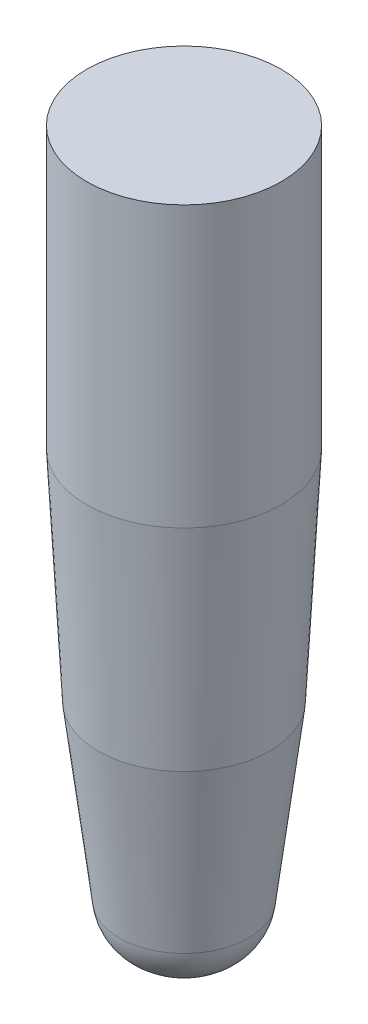
ISO-10303-21;
HEADER;
FILE_DESCRIPTION(('STEP AP214'),'2;1');
FILE_NAME('part.step','',(''),(''),'','','');
FILE_SCHEMA(('AUTOMOTIVE_DESIGN { 1 0 10303 214 1 1 1 1 }'));
ENDSEC;
DATA;
#1=APPLICATION_CONTEXT('core data for automotive mechanical design processes');
#2=APPLICATION_PROTOCOL_DEFINITION('international standard','automotive_design',2000,#1);
#3=PRODUCT_CONTEXT('',#1,'mechanical');
#4=PRODUCT('Part','Part','',(#3));
#5=PRODUCT_RELATED_PRODUCT_CATEGORY('part','',(#4));
#6=PRODUCT_DEFINITION_FORMATION('','',#4);
#7=PRODUCT_DEFINITION_CONTEXT('part definition',#1,'design');
#8=PRODUCT_DEFINITION('design','',#6,#7);
#9=PRODUCT_DEFINITION_SHAPE('','',#8);
#10=(LENGTH_UNIT() NAMED_UNIT(*) SI_UNIT(.MILLI.,.METRE.));
#11=(NAMED_UNIT(*) PLANE_ANGLE_UNIT() SI_UNIT($,.RADIAN.));
#12=(NAMED_UNIT(*) SI_UNIT($,.STERADIAN.) SOLID_ANGLE_UNIT());
#13=UNCERTAINTY_MEASURE_WITH_UNIT(LENGTH_MEASURE(1.E-05),#10,'distance_accuracy_value','');
#14=(GEOMETRIC_REPRESENTATION_CONTEXT(3) GLOBAL_UNCERTAINTY_ASSIGNED_CONTEXT((#13)) GLOBAL_UNIT_ASSIGNED_CONTEXT((#10,
#11,#12)) REPRESENTATION_CONTEXT('',''));
#15=CARTESIAN_POINT('',(0.,0.,0.));
#16=DIRECTION('',(0.,0.,1.));
#17=DIRECTION('',(1.,0.,0.));
#18=AXIS2_PLACEMENT_3D('',#15,#16,#17);
#19=CARTESIAN_POINT('',(0.,23.,0.));
#20=DIRECTION('',(0.,1.,0.));
#21=DIRECTION('',(0.,0.,1.));
#22=AXIS2_PLACEMENT_3D('',#19,#20,#21);
#23=PLANE('',#22);
#24=CARTESIAN_POINT('',(0.,23.,0.));
#25=DIRECTION('',(0.,1.,0.));
#26=DIRECTION('',(0.,0.,1.));
#27=AXIS2_PLACEMENT_3D('',#24,#25,#26);
#28=CIRCLE('',#27,8.);
#29=CARTESIAN_POINT('',(0.,23.,8.));
#30=VERTEX_POINT('',#29);
#31=EDGE_CURVE('E41',#30,#30,#28,.T.);
#32=ORIENTED_EDGE('',*,*,#31,.T.);
#33=EDGE_LOOP('',(#32));
#34=FACE_BOUND('',#33,.T.);
#35=ADVANCED_FACE('F34',(#34),#23,.T.);
#36=CARTESIAN_POINT('',(0.,22.,0.));
#37=DIRECTION('',(0.,-1.,0.));
#38=DIRECTION('',(0.,0.,-1.));
#39=AXIS2_PLACEMENT_3D('',#36,#37,#38);
#40=CYLINDRICAL_SURFACE('',#39,8.);
#41=CARTESIAN_POINT('',(0.,0.,0.));
#42=DIRECTION('',(0.,1.,0.));
#43=DIRECTION('',(0.,0.,1.));
#44=AXIS2_PLACEMENT_3D('',#41,#42,#43);
#45=CIRCLE('',#44,8.);
#46=CARTESIAN_POINT('',(0.,0.,8.));
#47=VERTEX_POINT('',#46);
#48=EDGE_CURVE('E10',#47,#47,#45,.T.);
#49=ORIENTED_EDGE('',*,*,#48,.T.);
#50=EDGE_LOOP('',(#49));
#51=FACE_BOUND('',#50,.T.);
#52=ORIENTED_EDGE('',*,*,#31,.F.);
#53=EDGE_LOOP('',(#52));
#54=FACE_BOUND('',#53,.T.);
#55=ADVANCED_FACE('F36',(#51,#54),#40,.T.);
#56=CARTESIAN_POINT('',(0.,0.,0.));
#57=DIRECTION('',(0.,1.,0.));
#58=DIRECTION('',(0.,0.,1.));
#59=AXIS2_PLACEMENT_3D('',#56,#57,#58);
#60=CONICAL_SURFACE('',#59,8.,0.05235987755983);
#61=CARTESIAN_POINT('',(0.,-18.,0.));
#62=DIRECTION('',(0.,1.,0.));
#63=DIRECTION('',(-1.,0.,0.));
#64=AXIS2_PLACEMENT_3D('',#61,#62,#63);
#65=CIRCLE('',#64,7.05665997290526);
#66=CARTESIAN_POINT('',(-7.05665997290526,-18.,0.));
#67=VERTEX_POINT('',#66);
#68=EDGE_CURVE('E54',#67,#67,#65,.T.);
#69=ORIENTED_EDGE('',*,*,#68,.T.);
#70=EDGE_LOOP('',(#69));
#71=FACE_BOUND('',#70,.T.);
#72=ORIENTED_EDGE('',*,*,#48,.F.);
#73=EDGE_LOOP('',(#72));
#74=FACE_BOUND('',#73,.T.);
#75=ADVANCED_FACE('F58',(#71,#74),#60,.T.);
#76=CARTESIAN_POINT('',(0.,-32.1821336333856,0.));
#77=DIRECTION('',(0.,1.,0.));
#78=DIRECTION('',(-1.,0.,0.));
#79=AXIS2_PLACEMENT_3D('',#76,#77,#78);
#80=CONICAL_SURFACE('',#79,5.31531292206364,0.122173047639607);
#81=ORIENTED_EDGE('',*,*,#68,.F.);
#82=EDGE_LOOP('',(#81));
#83=FACE_BOUND('',#82,.T.);
#84=CARTESIAN_POINT('',(0.,-32.1821336333856,0.));
#85=DIRECTION('',(0.,1.,0.));
#86=DIRECTION('',(-1.,0.,0.));
#87=AXIS2_PLACEMENT_3D('',#84,#85,#86);
#88=CIRCLE('',#87,5.31531292206364);
#89=CARTESIAN_POINT('',(-5.31531292206364,-32.1821336333856,0.));
#90=VERTEX_POINT('',#89);
#91=EDGE_CURVE('E45',#90,#90,#88,.T.);
#92=ORIENTED_EDGE('',*,*,#91,.T.);
#93=EDGE_LOOP('',(#92));
#94=FACE_BOUND('',#93,.T.);
#95=ADVANCED_FACE('F61',(#83,#94),#80,.T.);
#96=CARTESIAN_POINT('',(0.,-31.6522798310914,0.));
#97=DIRECTION('',(0.,1.,0.));
#98=DIRECTION('',(-1.,0.,0.));
#99=AXIS2_PLACEMENT_3D('',#96,#97,#98);
#100=DEGENERATE_TOROIDAL_SURFACE('',#99,1.,4.34772016890865,.T.);
#101=ORIENTED_EDGE('',*,*,#91,.F.);
#102=EDGE_LOOP('',(#101));
#103=FACE_BOUND('',#102,.T.);
#104=CARTESIAN_POINT('',(0.,-36.,0.));
#105=DIRECTION('',(0.,1.,0.));
#106=DIRECTION('',(-1.,0.,0.));
#107=AXIS2_PLACEMENT_3D('',#104,#105,#106);
#108=CIRCLE('',#107,1.);
#109=CARTESIAN_POINT('',(-0.999999999999999,-36.,0.));
#110=VERTEX_POINT('',#109);
#111=EDGE_CURVE('E49',#110,#110,#108,.T.);
#112=ORIENTED_EDGE('',*,*,#111,.T.);
#113=EDGE_LOOP('',(#112));
#114=FACE_BOUND('',#113,.T.);
#115=ADVANCED_FACE('F64',(#103,#114),#100,.T.);
#116=CARTESIAN_POINT('',(0.,-36.,0.));
#117=DIRECTION('',(0.,1.,0.));
#118=DIRECTION('',(-1.,0.,0.));
#119=AXIS2_PLACEMENT_3D('',#116,#117,#118);
#120=PLANE('',#119);
#121=ORIENTED_EDGE('',*,*,#111,.F.);
#122=EDGE_LOOP('',(#121));
#123=FACE_BOUND('',#122,.T.);
#124=ADVANCED_FACE('F70',(#123),#120,.F.);
#125=CLOSED_SHELL('',(#35,#55,#75,#95,#115,#124));
#126=MANIFOLD_SOLID_BREP('B2',#125);
#127=ADVANCED_BREP_SHAPE_REPRESENTATION('',(#18,#126),#14);
#128=SHAPE_DEFINITION_REPRESENTATION(#9,#127);
ENDSEC;
END-ISO-10303-21;
